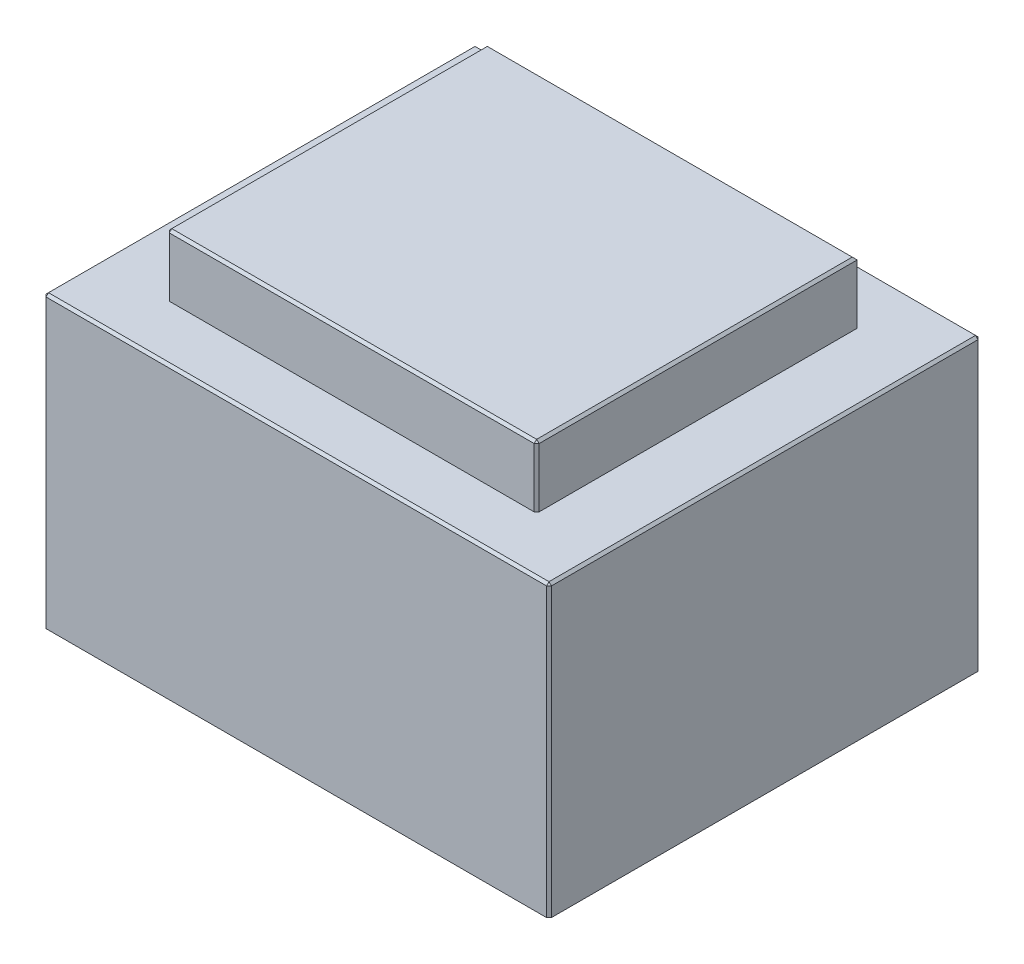
ISO-10303-21;
HEADER;
FILE_DESCRIPTION(('STEP AP214'),'2;1');
FILE_NAME('part.step','',(''),(''),'','','');
FILE_SCHEMA(('AUTOMOTIVE_DESIGN { 1 0 10303 214 1 1 1 1 }'));
ENDSEC;
DATA;
#1=APPLICATION_CONTEXT('core data for automotive mechanical design processes');
#2=APPLICATION_PROTOCOL_DEFINITION('international standard','automotive_design',2000,#1);
#3=PRODUCT_CONTEXT('',#1,'mechanical');
#4=PRODUCT('Part','Part','',(#3));
#5=PRODUCT_RELATED_PRODUCT_CATEGORY('part','',(#4));
#6=PRODUCT_DEFINITION_FORMATION('','',#4);
#7=PRODUCT_DEFINITION_CONTEXT('part definition',#1,'design');
#8=PRODUCT_DEFINITION('design','',#6,#7);
#9=PRODUCT_DEFINITION_SHAPE('','',#8);
#10=(LENGTH_UNIT() NAMED_UNIT(*) SI_UNIT(.MILLI.,.METRE.));
#11=(NAMED_UNIT(*) PLANE_ANGLE_UNIT() SI_UNIT($,.RADIAN.));
#12=(NAMED_UNIT(*) SI_UNIT($,.STERADIAN.) SOLID_ANGLE_UNIT());
#13=UNCERTAINTY_MEASURE_WITH_UNIT(LENGTH_MEASURE(1.E-05),#10,'distance_accuracy_value','');
#14=(GEOMETRIC_REPRESENTATION_CONTEXT(3) GLOBAL_UNCERTAINTY_ASSIGNED_CONTEXT((#13)) GLOBAL_UNIT_ASSIGNED_CONTEXT((#10,
#11,#12)) REPRESENTATION_CONTEXT('',''));
#15=CARTESIAN_POINT('',(0.,0.,0.));
#16=DIRECTION('',(0.,0.,1.));
#17=DIRECTION('',(1.,0.,0.));
#18=AXIS2_PLACEMENT_3D('',#15,#16,#17);
#19=CARTESIAN_POINT('',(0.,0.,0.));
#20=DIRECTION('',(0.,1.,0.));
#21=DIRECTION('',(0.,0.,1.));
#22=AXIS2_PLACEMENT_3D('',#19,#20,#21);
#23=PLANE('',#22);
#24=CARTESIAN_POINT('',(-5.,0.,-12.5));
#25=DIRECTION('',(0.,1.,0.));
#26=DIRECTION('',(0.,0.,1.));
#27=AXIS2_PLACEMENT_3D('',#24,#25,#26);
#28=CIRCLE('',#27,0.4);
#29=CARTESIAN_POINT('',(-5.,0.,-12.1));
#30=VERTEX_POINT('',#29);
#31=EDGE_CURVE('E215',#30,#30,#28,.F.);
#32=ORIENTED_EDGE('',*,*,#31,.F.);
#33=EDGE_LOOP('',(#32));
#34=FACE_BOUND('',#33,.T.);
#35=CARTESIAN_POINT('',(-10.,0.,12.5));
#36=DIRECTION('',(0.,1.,0.));
#37=DIRECTION('',(0.,0.,1.));
#38=AXIS2_PLACEMENT_3D('',#35,#36,#37);
#39=CIRCLE('',#38,0.399999999999999);
#40=CARTESIAN_POINT('',(-10.,0.,12.9));
#41=VERTEX_POINT('',#40);
#42=EDGE_CURVE('E209',#41,#41,#39,.F.);
#43=ORIENTED_EDGE('',*,*,#42,.F.);
#44=EDGE_LOOP('',(#43));
#45=FACE_BOUND('',#44,.T.);
#46=DIRECTION('',(0.,0.,1.));
#47=VECTOR('',#46,1.);
#48=CARTESIAN_POINT('',(-20.5,0.,17.5));
#49=LINE('',#48,#47);
#50=CARTESIAN_POINT('',(-20.5,0.,-17.3));
#51=VERTEX_POINT('',#50);
#52=CARTESIAN_POINT('',(-20.5,0.,17.3));
#53=VERTEX_POINT('',#52);
#54=EDGE_CURVE('E184',#51,#53,#49,.T.);
#55=ORIENTED_EDGE('',*,*,#54,.F.);
#56=DIRECTION('',(-0.707106781186548,0.,0.707106781186548));
#57=VECTOR('',#56,1.);
#58=CARTESIAN_POINT('',(-20.5,0.,-17.3));
#59=LINE('',#58,#57);
#60=CARTESIAN_POINT('',(-20.3,0.,-17.5));
#61=VERTEX_POINT('',#60);
#62=EDGE_CURVE('E262',#51,#61,#59,.F.);
#63=ORIENTED_EDGE('',*,*,#62,.T.);
#64=DIRECTION('',(-1.,0.,0.));
#65=VECTOR('',#64,1.);
#66=CARTESIAN_POINT('',(20.5,0.,-17.5));
#67=LINE('',#66,#65);
#68=CARTESIAN_POINT('',(20.3,0.,-17.5));
#69=VERTEX_POINT('',#68);
#70=EDGE_CURVE('E206',#69,#61,#67,.T.);
#71=ORIENTED_EDGE('',*,*,#70,.F.);
#72=DIRECTION('',(-0.707106781186548,0.,-0.707106781186548));
#73=VECTOR('',#72,1.);
#74=CARTESIAN_POINT('',(20.3,0.,-17.5));
#75=LINE('',#74,#73);
#76=CARTESIAN_POINT('',(20.5,0.,-17.3));
#77=VERTEX_POINT('',#76);
#78=EDGE_CURVE('E260',#69,#77,#75,.F.);
#79=ORIENTED_EDGE('',*,*,#78,.T.);
#80=DIRECTION('',(0.,0.,-1.));
#81=VECTOR('',#80,1.);
#82=CARTESIAN_POINT('',(20.5,0.,17.5));
#83=LINE('',#82,#81);
#84=CARTESIAN_POINT('',(20.5,0.,17.3));
#85=VERTEX_POINT('',#84);
#86=EDGE_CURVE('E203',#85,#77,#83,.T.);
#87=ORIENTED_EDGE('',*,*,#86,.F.);
#88=DIRECTION('',(0.707106781186548,0.,-0.707106781186548));
#89=VECTOR('',#88,1.);
#90=CARTESIAN_POINT('',(20.5,0.,17.3));
#91=LINE('',#90,#89);
#92=CARTESIAN_POINT('',(20.3,0.,17.5));
#93=VERTEX_POINT('',#92);
#94=EDGE_CURVE('E258',#85,#93,#91,.F.);
#95=ORIENTED_EDGE('',*,*,#94,.T.);
#96=DIRECTION('',(1.,0.,0.));
#97=VECTOR('',#96,1.);
#98=CARTESIAN_POINT('',(20.5,0.,17.5));
#99=LINE('',#98,#97);
#100=CARTESIAN_POINT('',(-20.3,0.,17.5));
#101=VERTEX_POINT('',#100);
#102=EDGE_CURVE('E200',#101,#93,#99,.T.);
#103=ORIENTED_EDGE('',*,*,#102,.F.);
#104=DIRECTION('',(0.707106781186548,0.,0.707106781186548));
#105=VECTOR('',#104,1.);
#106=CARTESIAN_POINT('',(-20.3,0.,17.5));
#107=LINE('',#106,#105);
#108=EDGE_CURVE('E256',#101,#53,#107,.F.);
#109=ORIENTED_EDGE('',*,*,#108,.T.);
#110=EDGE_LOOP('',(#55,#63,#71,#79,#87,#95,#103,#109));
#111=FACE_BOUND('',#110,.T.);
#112=CARTESIAN_POINT('',(10.,0.,12.5));
#113=DIRECTION('',(0.,1.,0.));
#114=DIRECTION('',(0.,0.,1.));
#115=AXIS2_PLACEMENT_3D('',#112,#113,#114);
#116=CIRCLE('',#115,0.399999999999999);
#117=CARTESIAN_POINT('',(10.,0.,12.9));
#118=VERTEX_POINT('',#117);
#119=EDGE_CURVE('E212',#118,#118,#116,.F.);
#120=ORIENTED_EDGE('',*,*,#119,.F.);
#121=EDGE_LOOP('',(#120));
#122=FACE_BOUND('',#121,.T.);
#123=CARTESIAN_POINT('',(5.,0.,-12.5));
#124=DIRECTION('',(0.,1.,0.));
#125=DIRECTION('',(0.,0.,1.));
#126=AXIS2_PLACEMENT_3D('',#123,#124,#125);
#127=CIRCLE('',#126,0.4);
#128=CARTESIAN_POINT('',(5.,0.,-12.1));
#129=VERTEX_POINT('',#128);
#130=EDGE_CURVE('E218',#129,#129,#127,.F.);
#131=ORIENTED_EDGE('',*,*,#130,.F.);
#132=EDGE_LOOP('',(#131));
#133=FACE_BOUND('',#132,.T.);
#134=ADVANCED_FACE('F33',(#34,#45,#111,#122,#133),#23,.F.);
#135=CARTESIAN_POINT('',(0.,23.5,0.));
#136=DIRECTION('',(0.,1.,0.));
#137=DIRECTION('',(0.,0.,1.));
#138=AXIS2_PLACEMENT_3D('',#135,#136,#137);
#139=PLANE('',#138);
#140=DIRECTION('',(-1.,0.,0.));
#141=VECTOR('',#140,1.);
#142=CARTESIAN_POINT('',(-20.5,23.5,-17.3));
#143=LINE('',#142,#141);
#144=CARTESIAN_POINT('',(20.3,23.5,-17.3));
#145=VERTEX_POINT('',#144);
#146=CARTESIAN_POINT('',(-20.3,23.5,-17.3));
#147=VERTEX_POINT('',#146);
#148=EDGE_CURVE('E50',#145,#147,#143,.T.);
#149=ORIENTED_EDGE('',*,*,#148,.T.);
#150=DIRECTION('',(0.,0.,1.));
#151=VECTOR('',#150,1.);
#152=CARTESIAN_POINT('',(-20.3,23.5,17.5));
#153=LINE('',#152,#151);
#154=CARTESIAN_POINT('',(-20.3,23.5,17.3));
#155=VERTEX_POINT('',#154);
#156=EDGE_CURVE('E286',#147,#155,#153,.T.);
#157=ORIENTED_EDGE('',*,*,#156,.T.);
#158=DIRECTION('',(1.,0.,0.));
#159=VECTOR('',#158,1.);
#160=CARTESIAN_POINT('',(20.5,23.5,17.3));
#161=LINE('',#160,#159);
#162=CARTESIAN_POINT('',(20.3,23.5,17.3));
#163=VERTEX_POINT('',#162);
#164=EDGE_CURVE('E282',#155,#163,#161,.T.);
#165=ORIENTED_EDGE('',*,*,#164,.T.);
#166=DIRECTION('',(0.,0.,-1.));
#167=VECTOR('',#166,1.);
#168=CARTESIAN_POINT('',(20.3,23.5,-17.5));
#169=LINE('',#168,#167);
#170=EDGE_CURVE('E55',#163,#145,#169,.T.);
#171=ORIENTED_EDGE('',*,*,#170,.T.);
#172=EDGE_LOOP('',(#149,#157,#165,#171));
#173=FACE_BOUND('',#172,.T.);
#174=DIRECTION('',(-1.,0.,0.));
#175=VECTOR('',#174,1.);
#176=CARTESIAN_POINT('',(-15.,23.5,-13.));
#177=LINE('',#176,#175);
#178=CARTESIAN_POINT('',(15.,23.5,-13.));
#179=VERTEX_POINT('',#178);
#180=CARTESIAN_POINT('',(-14.8,23.5,-13.));
#181=VERTEX_POINT('',#180);
#182=EDGE_CURVE('E175',#179,#181,#177,.T.);
#183=ORIENTED_EDGE('',*,*,#182,.F.);
#184=DIRECTION('',(0.,0.,-1.));
#185=VECTOR('',#184,1.);
#186=CARTESIAN_POINT('',(15.,23.5,-13.));
#187=LINE('',#186,#185);
#188=CARTESIAN_POINT('',(15.,23.5,12.8));
#189=VERTEX_POINT('',#188);
#190=EDGE_CURVE('E165',#189,#179,#187,.T.);
#191=ORIENTED_EDGE('',*,*,#190,.F.);
#192=DIRECTION('',(0.707106781186548,0.,-0.707106781186548));
#193=VECTOR('',#192,1.);
#194=CARTESIAN_POINT('',(15.,23.5,12.8));
#195=LINE('',#194,#193);
#196=CARTESIAN_POINT('',(14.8,23.5,13.));
#197=VERTEX_POINT('',#196);
#198=EDGE_CURVE('E11',#189,#197,#195,.F.);
#199=ORIENTED_EDGE('',*,*,#198,.T.);
#200=DIRECTION('',(1.,0.,0.));
#201=VECTOR('',#200,1.);
#202=CARTESIAN_POINT('',(-15.,23.5,13.));
#203=LINE('',#202,#201);
#204=CARTESIAN_POINT('',(-14.8,23.5,13.));
#205=VERTEX_POINT('',#204);
#206=EDGE_CURVE('E185',#205,#197,#203,.T.);
#207=ORIENTED_EDGE('',*,*,#206,.F.);
#208=DIRECTION('',(0.707106781186548,0.,0.707106781186548));
#209=VECTOR('',#208,1.);
#210=CARTESIAN_POINT('',(-14.8,23.5,13.));
#211=LINE('',#210,#209);
#212=CARTESIAN_POINT('',(-15.,23.5,12.8));
#213=VERTEX_POINT('',#212);
#214=EDGE_CURVE('E42',#205,#213,#211,.F.);
#215=ORIENTED_EDGE('',*,*,#214,.T.);
#216=DIRECTION('',(0.,0.,1.));
#217=VECTOR('',#216,1.);
#218=CARTESIAN_POINT('',(-15.,23.5,-13.));
#219=LINE('',#218,#217);
#220=CARTESIAN_POINT('',(-15.,23.5,-12.8));
#221=VERTEX_POINT('',#220);
#222=EDGE_CURVE('E190',#221,#213,#219,.T.);
#223=ORIENTED_EDGE('',*,*,#222,.F.);
#224=DIRECTION('',(-0.707106781186548,0.,0.707106781186548));
#225=VECTOR('',#224,1.);
#226=CARTESIAN_POINT('',(-15.,23.5,-12.8));
#227=LINE('',#226,#225);
#228=EDGE_CURVE('E189',#221,#181,#227,.F.);
#229=ORIENTED_EDGE('',*,*,#228,.T.);
#230=EDGE_LOOP('',(#183,#191,#199,#207,#215,#223,#229));
#231=FACE_BOUND('',#230,.T.);
#232=ADVANCED_FACE('F187',(#173,#231),#139,.T.);
#233=CARTESIAN_POINT('',(-20.5,23.5,17.5));
#234=DIRECTION('',(1.,0.,0.));
#235=DIRECTION('',(0.,0.,-1.));
#236=AXIS2_PLACEMENT_3D('',#233,#234,#235);
#237=PLANE('',#236);
#238=DIRECTION('',(0.,0.,-1.));
#239=VECTOR('',#238,1.);
#240=CARTESIAN_POINT('',(-20.5,23.3,-17.5));
#241=LINE('',#240,#239);
#242=CARTESIAN_POINT('',(-20.5,23.3,17.3));
#243=VERTEX_POINT('',#242);
#244=CARTESIAN_POINT('',(-20.5,23.3,-17.3));
#245=VERTEX_POINT('',#244);
#246=EDGE_CURVE('E249',#243,#245,#241,.T.);
#247=ORIENTED_EDGE('',*,*,#246,.T.);
#248=DIRECTION('',(0.,-1.,0.));
#249=VECTOR('',#248,1.);
#250=CARTESIAN_POINT('',(-20.5,23.5,-17.3));
#251=LINE('',#250,#249);
#252=EDGE_CURVE('E253',#245,#51,#251,.T.);
#253=ORIENTED_EDGE('',*,*,#252,.T.);
#254=ORIENTED_EDGE('',*,*,#54,.T.);
#255=DIRECTION('',(0.,1.,0.));
#256=VECTOR('',#255,1.);
#257=CARTESIAN_POINT('',(-20.5,23.5,17.3));
#258=LINE('',#257,#256);
#259=EDGE_CURVE('E251',#53,#243,#258,.T.);
#260=ORIENTED_EDGE('',*,*,#259,.T.);
#261=EDGE_LOOP('',(#247,#253,#254,#260));
#262=FACE_BOUND('',#261,.T.);
#263=ADVANCED_FACE('F408',(#262),#237,.F.);
#264=CARTESIAN_POINT('',(20.5,23.5,17.5));
#265=DIRECTION('',(0.,0.,-1.));
#266=DIRECTION('',(-1.,0.,0.));
#267=AXIS2_PLACEMENT_3D('',#264,#265,#266);
#268=PLANE('',#267);
#269=ORIENTED_EDGE('',*,*,#102,.T.);
#270=DIRECTION('',(0.,1.,0.));
#271=VECTOR('',#270,1.);
#272=CARTESIAN_POINT('',(20.3,23.5,17.5));
#273=LINE('',#272,#271);
#274=CARTESIAN_POINT('',(20.3,23.3,17.5));
#275=VERTEX_POINT('',#274);
#276=EDGE_CURVE('E280',#93,#275,#273,.T.);
#277=ORIENTED_EDGE('',*,*,#276,.T.);
#278=DIRECTION('',(-1.,0.,0.));
#279=VECTOR('',#278,1.);
#280=CARTESIAN_POINT('',(-20.5,23.3,17.5));
#281=LINE('',#280,#279);
#282=CARTESIAN_POINT('',(-20.3,23.3,17.5));
#283=VERTEX_POINT('',#282);
#284=EDGE_CURVE('E276',#275,#283,#281,.T.);
#285=ORIENTED_EDGE('',*,*,#284,.T.);
#286=DIRECTION('',(0.,-1.,0.));
#287=VECTOR('',#286,1.);
#288=CARTESIAN_POINT('',(-20.3,23.5,17.5));
#289=LINE('',#288,#287);
#290=EDGE_CURVE('E278',#283,#101,#289,.T.);
#291=ORIENTED_EDGE('',*,*,#290,.T.);
#292=EDGE_LOOP('',(#269,#277,#285,#291));
#293=FACE_BOUND('',#292,.T.);
#294=ADVANCED_FACE('F401',(#293),#268,.F.);
#295=CARTESIAN_POINT('',(20.5,23.5,17.5));
#296=DIRECTION('',(-1.,0.,0.));
#297=DIRECTION('',(0.,0.,1.));
#298=AXIS2_PLACEMENT_3D('',#295,#296,#297);
#299=PLANE('',#298);
#300=ORIENTED_EDGE('',*,*,#86,.T.);
#301=DIRECTION('',(0.,1.,0.));
#302=VECTOR('',#301,1.);
#303=CARTESIAN_POINT('',(20.5,23.5,-17.3));
#304=LINE('',#303,#302);
#305=CARTESIAN_POINT('',(20.5,23.3,-17.3));
#306=VERTEX_POINT('',#305);
#307=EDGE_CURVE('E274',#77,#306,#304,.T.);
#308=ORIENTED_EDGE('',*,*,#307,.T.);
#309=DIRECTION('',(0.,0.,1.));
#310=VECTOR('',#309,1.);
#311=CARTESIAN_POINT('',(20.5,23.3,17.5));
#312=LINE('',#311,#310);
#313=CARTESIAN_POINT('',(20.5,23.3,17.3));
#314=VERTEX_POINT('',#313);
#315=EDGE_CURVE('E270',#306,#314,#312,.T.);
#316=ORIENTED_EDGE('',*,*,#315,.T.);
#317=DIRECTION('',(0.,-1.,0.));
#318=VECTOR('',#317,1.);
#319=CARTESIAN_POINT('',(20.5,23.5,17.3));
#320=LINE('',#319,#318);
#321=EDGE_CURVE('E272',#314,#85,#320,.T.);
#322=ORIENTED_EDGE('',*,*,#321,.T.);
#323=EDGE_LOOP('',(#300,#308,#316,#322));
#324=FACE_BOUND('',#323,.T.);
#325=ADVANCED_FACE('F366',(#324),#299,.F.);
#326=CARTESIAN_POINT('',(20.5,23.5,-17.5));
#327=DIRECTION('',(0.,0.,1.));
#328=DIRECTION('',(1.,0.,0.));
#329=AXIS2_PLACEMENT_3D('',#326,#327,#328);
#330=PLANE('',#329);
#331=ORIENTED_EDGE('',*,*,#70,.T.);
#332=DIRECTION('',(0.,1.,0.));
#333=VECTOR('',#332,1.);
#334=CARTESIAN_POINT('',(-20.3,23.5,-17.5));
#335=LINE('',#334,#333);
#336=CARTESIAN_POINT('',(-20.3,23.3,-17.5));
#337=VERTEX_POINT('',#336);
#338=EDGE_CURVE('E268',#61,#337,#335,.T.);
#339=ORIENTED_EDGE('',*,*,#338,.T.);
#340=DIRECTION('',(1.,0.,0.));
#341=VECTOR('',#340,1.);
#342=CARTESIAN_POINT('',(20.5,23.3,-17.5));
#343=LINE('',#342,#341);
#344=CARTESIAN_POINT('',(20.3,23.3,-17.5));
#345=VERTEX_POINT('',#344);
#346=EDGE_CURVE('E264',#337,#345,#343,.T.);
#347=ORIENTED_EDGE('',*,*,#346,.T.);
#348=DIRECTION('',(0.,-1.,0.));
#349=VECTOR('',#348,1.);
#350=CARTESIAN_POINT('',(20.3,23.5,-17.5));
#351=LINE('',#350,#349);
#352=EDGE_CURVE('E266',#345,#69,#351,.T.);
#353=ORIENTED_EDGE('',*,*,#352,.T.);
#354=EDGE_LOOP('',(#331,#339,#347,#353));
#355=FACE_BOUND('',#354,.T.);
#356=ADVANCED_FACE('F413',(#355),#330,.F.);
#357=CARTESIAN_POINT('',(15.,28.5,-13.));
#358=DIRECTION('',(-1.,0.,0.));
#359=DIRECTION('',(0.,0.,1.));
#360=AXIS2_PLACEMENT_3D('',#357,#358,#359);
#361=PLANE('',#360);
#362=DIRECTION('',(0.,-1.,0.));
#363=VECTOR('',#362,1.);
#364=CARTESIAN_POINT('',(15.,28.5,-13.));
#365=LINE('',#364,#363);
#366=CARTESIAN_POINT('',(15.,28.3,-13.));
#367=VERTEX_POINT('',#366);
#368=EDGE_CURVE('E168',#367,#179,#365,.T.);
#369=ORIENTED_EDGE('',*,*,#368,.F.);
#370=DIRECTION('',(0.,0.,1.));
#371=VECTOR('',#370,1.);
#372=CARTESIAN_POINT('',(15.,28.3,13.));
#373=LINE('',#372,#371);
#374=CARTESIAN_POINT('',(15.,28.3,12.8));
#375=VERTEX_POINT('',#374);
#376=EDGE_CURVE('E247',#367,#375,#373,.T.);
#377=ORIENTED_EDGE('',*,*,#376,.T.);
#378=DIRECTION('',(0.,-1.,0.));
#379=VECTOR('',#378,1.);
#380=CARTESIAN_POINT('',(15.,28.5,12.8));
#381=LINE('',#380,#379);
#382=EDGE_CURVE('E171',#375,#189,#381,.T.);
#383=ORIENTED_EDGE('',*,*,#382,.T.);
#384=ORIENTED_EDGE('',*,*,#190,.T.);
#385=EDGE_LOOP('',(#369,#377,#383,#384));
#386=FACE_BOUND('',#385,.T.);
#387=ADVANCED_FACE('F167',(#386),#361,.F.);
#388=CARTESIAN_POINT('',(-15.,28.5,-13.));
#389=DIRECTION('',(0.,0.,1.));
#390=DIRECTION('',(1.,0.,0.));
#391=AXIS2_PLACEMENT_3D('',#388,#389,#390);
#392=PLANE('',#391);
#393=ORIENTED_EDGE('',*,*,#182,.T.);
#394=DIRECTION('',(0.,1.,0.));
#395=VECTOR('',#394,1.);
#396=CARTESIAN_POINT('',(-14.8,28.5,-13.));
#397=LINE('',#396,#395);
#398=CARTESIAN_POINT('',(-14.8,28.3,-13.));
#399=VERTEX_POINT('',#398);
#400=EDGE_CURVE('E229',#181,#399,#397,.T.);
#401=ORIENTED_EDGE('',*,*,#400,.T.);
#402=DIRECTION('',(1.,0.,0.));
#403=VECTOR('',#402,1.);
#404=CARTESIAN_POINT('',(15.,28.3,-13.));
#405=LINE('',#404,#403);
#406=EDGE_CURVE('E183',#399,#367,#405,.T.);
#407=ORIENTED_EDGE('',*,*,#406,.T.);
#408=ORIENTED_EDGE('',*,*,#368,.T.);
#409=EDGE_LOOP('',(#393,#401,#407,#408));
#410=FACE_BOUND('',#409,.T.);
#411=ADVANCED_FACE('F180',(#410),#392,.F.);
#412=CARTESIAN_POINT('',(-15.,28.5,-13.));
#413=DIRECTION('',(1.,0.,0.));
#414=DIRECTION('',(0.,0.,-1.));
#415=AXIS2_PLACEMENT_3D('',#412,#413,#414);
#416=PLANE('',#415);
#417=DIRECTION('',(0.,0.,-1.));
#418=VECTOR('',#417,1.);
#419=CARTESIAN_POINT('',(-15.,28.3,-13.));
#420=LINE('',#419,#418);
#421=CARTESIAN_POINT('',(-15.,28.3,12.8));
#422=VERTEX_POINT('',#421);
#423=CARTESIAN_POINT('',(-15.,28.3,-12.8));
#424=VERTEX_POINT('',#423);
#425=EDGE_CURVE('E221',#422,#424,#420,.T.);
#426=ORIENTED_EDGE('',*,*,#425,.T.);
#427=DIRECTION('',(0.,-1.,0.));
#428=VECTOR('',#427,1.);
#429=CARTESIAN_POINT('',(-15.,28.5,-12.8));
#430=LINE('',#429,#428);
#431=EDGE_CURVE('E225',#424,#221,#430,.T.);
#432=ORIENTED_EDGE('',*,*,#431,.T.);
#433=ORIENTED_EDGE('',*,*,#222,.T.);
#434=DIRECTION('',(0.,1.,0.));
#435=VECTOR('',#434,1.);
#436=CARTESIAN_POINT('',(-15.,28.5,12.8));
#437=LINE('',#436,#435);
#438=EDGE_CURVE('E223',#213,#422,#437,.T.);
#439=ORIENTED_EDGE('',*,*,#438,.T.);
#440=EDGE_LOOP('',(#426,#432,#433,#439));
#441=FACE_BOUND('',#440,.T.);
#442=ADVANCED_FACE('F435',(#441),#416,.F.);
#443=CARTESIAN_POINT('',(-15.,28.5,13.));
#444=DIRECTION('',(0.,0.,-1.));
#445=DIRECTION('',(-1.,0.,0.));
#446=AXIS2_PLACEMENT_3D('',#443,#444,#445);
#447=PLANE('',#446);
#448=DIRECTION('',(-1.,0.,0.));
#449=VECTOR('',#448,1.);
#450=CARTESIAN_POINT('',(-15.,28.3,13.));
#451=LINE('',#450,#449);
#452=CARTESIAN_POINT('',(14.8,28.3,13.));
#453=VERTEX_POINT('',#452);
#454=CARTESIAN_POINT('',(-14.8,28.3,13.));
#455=VERTEX_POINT('',#454);
#456=EDGE_CURVE('E233',#453,#455,#451,.T.);
#457=ORIENTED_EDGE('',*,*,#456,.T.);
#458=DIRECTION('',(0.,-1.,0.));
#459=VECTOR('',#458,1.);
#460=CARTESIAN_POINT('',(-14.8,28.5,13.));
#461=LINE('',#460,#459);
#462=EDGE_CURVE('E235',#455,#205,#461,.T.);
#463=ORIENTED_EDGE('',*,*,#462,.T.);
#464=ORIENTED_EDGE('',*,*,#206,.T.);
#465=DIRECTION('',(0.,1.,0.));
#466=VECTOR('',#465,1.);
#467=CARTESIAN_POINT('',(14.8,28.5,13.));
#468=LINE('',#467,#466);
#469=EDGE_CURVE('E231',#197,#453,#468,.T.);
#470=ORIENTED_EDGE('',*,*,#469,.T.);
#471=EDGE_LOOP('',(#457,#463,#464,#470));
#472=FACE_BOUND('',#471,.T.);
#473=ADVANCED_FACE('F438',(#472),#447,.F.);
#474=CARTESIAN_POINT('',(0.,28.5,0.));
#475=DIRECTION('',(0.,1.,0.));
#476=DIRECTION('',(0.,0.,1.));
#477=AXIS2_PLACEMENT_3D('',#474,#475,#476);
#478=PLANE('',#477);
#479=DIRECTION('',(0.,0.,1.));
#480=VECTOR('',#479,1.);
#481=CARTESIAN_POINT('',(-14.8,28.5,13.));
#482=LINE('',#481,#480);
#483=CARTESIAN_POINT('',(-14.8,28.5,-12.8));
#484=VERTEX_POINT('',#483);
#485=CARTESIAN_POINT('',(-14.8,28.5,12.8));
#486=VERTEX_POINT('',#485);
#487=EDGE_CURVE('E241',#484,#486,#482,.T.);
#488=ORIENTED_EDGE('',*,*,#487,.T.);
#489=DIRECTION('',(1.,0.,0.));
#490=VECTOR('',#489,1.);
#491=CARTESIAN_POINT('',(15.,28.5,12.8));
#492=LINE('',#491,#490);
#493=CARTESIAN_POINT('',(14.8,28.5,12.8));
#494=VERTEX_POINT('',#493);
#495=EDGE_CURVE('E243',#486,#494,#492,.T.);
#496=ORIENTED_EDGE('',*,*,#495,.T.);
#497=DIRECTION('',(0.,0.,-1.));
#498=VECTOR('',#497,1.);
#499=CARTESIAN_POINT('',(14.8,28.5,-13.));
#500=LINE('',#499,#498);
#501=CARTESIAN_POINT('',(14.8,28.5,-12.8));
#502=VERTEX_POINT('',#501);
#503=EDGE_CURVE('E237',#494,#502,#500,.T.);
#504=ORIENTED_EDGE('',*,*,#503,.T.);
#505=DIRECTION('',(-1.,0.,0.));
#506=VECTOR('',#505,1.);
#507=CARTESIAN_POINT('',(-15.,28.5,-12.8));
#508=LINE('',#507,#506);
#509=EDGE_CURVE('E239',#502,#484,#508,.T.);
#510=ORIENTED_EDGE('',*,*,#509,.T.);
#511=EDGE_LOOP('',(#488,#496,#504,#510));
#512=FACE_BOUND('',#511,.T.);
#513=ADVANCED_FACE('F442',(#512),#478,.T.);
#514=CARTESIAN_POINT('',(-10.,-2.5,12.5));
#515=DIRECTION('',(0.,1.,0.));
#516=DIRECTION('',(0.,0.,1.));
#517=AXIS2_PLACEMENT_3D('',#514,#515,#516);
#518=CYLINDRICAL_SURFACE('',#517,0.399999999999999);
#519=CARTESIAN_POINT('',(-10.,-2.5,12.5));
#520=DIRECTION('',(0.,-1.,0.));
#521=DIRECTION('',(0.,0.,-1.));
#522=AXIS2_PLACEMENT_3D('',#519,#520,#521);
#523=CIRCLE('',#522,0.399999999999999);
#524=CARTESIAN_POINT('',(-10.,-2.5,12.1));
#525=VERTEX_POINT('',#524);
#526=EDGE_CURVE('E176',#525,#525,#523,.T.);
#527=ORIENTED_EDGE('',*,*,#526,.F.);
#528=EDGE_LOOP('',(#527));
#529=FACE_BOUND('',#528,.T.);
#530=ORIENTED_EDGE('',*,*,#42,.T.);
#531=EDGE_LOOP('',(#530));
#532=FACE_BOUND('',#531,.T.);
#533=ADVANCED_FACE('F446',(#529,#532),#518,.T.);
#534=CARTESIAN_POINT('',(-10.,-2.5,12.5));
#535=DIRECTION('',(0.,-1.,0.));
#536=DIRECTION('',(0.,0.,-1.));
#537=AXIS2_PLACEMENT_3D('',#534,#535,#536);
#538=PLANE('',#537);
#539=ORIENTED_EDGE('',*,*,#526,.T.);
#540=EDGE_LOOP('',(#539));
#541=FACE_BOUND('',#540,.T.);
#542=ADVANCED_FACE('F450',(#541),#538,.T.);
#543=CARTESIAN_POINT('',(10.,-2.5,12.5));
#544=DIRECTION('',(0.,1.,0.));
#545=DIRECTION('',(0.,0.,1.));
#546=AXIS2_PLACEMENT_3D('',#543,#544,#545);
#547=CYLINDRICAL_SURFACE('',#546,0.399999999999999);
#548=CARTESIAN_POINT('',(10.,-2.5,12.5));
#549=DIRECTION('',(0.,-1.,0.));
#550=DIRECTION('',(0.,0.,-1.));
#551=AXIS2_PLACEMENT_3D('',#548,#549,#550);
#552=CIRCLE('',#551,0.399999999999999);
#553=CARTESIAN_POINT('',(10.,-2.5,12.1));
#554=VERTEX_POINT('',#553);
#555=EDGE_CURVE('E489',#554,#554,#552,.T.);
#556=ORIENTED_EDGE('',*,*,#555,.F.);
#557=EDGE_LOOP('',(#556));
#558=FACE_BOUND('',#557,.T.);
#559=ORIENTED_EDGE('',*,*,#119,.T.);
#560=EDGE_LOOP('',(#559));
#561=FACE_BOUND('',#560,.T.);
#562=ADVANCED_FACE('F454',(#558,#561),#547,.T.);
#563=CARTESIAN_POINT('',(10.,-2.5,12.5));
#564=DIRECTION('',(0.,-1.,0.));
#565=DIRECTION('',(0.,0.,-1.));
#566=AXIS2_PLACEMENT_3D('',#563,#564,#565);
#567=PLANE('',#566);
#568=ORIENTED_EDGE('',*,*,#555,.T.);
#569=EDGE_LOOP('',(#568));
#570=FACE_BOUND('',#569,.T.);
#571=ADVANCED_FACE('F458',(#570),#567,.T.);
#572=CARTESIAN_POINT('',(-5.,-2.5,-12.5));
#573=DIRECTION('',(0.,1.,0.));
#574=DIRECTION('',(0.,0.,1.));
#575=AXIS2_PLACEMENT_3D('',#572,#573,#574);
#576=CYLINDRICAL_SURFACE('',#575,0.4);
#577=CARTESIAN_POINT('',(-5.,-2.5,-12.5));
#578=DIRECTION('',(0.,-1.,0.));
#579=DIRECTION('',(0.,0.,-1.));
#580=AXIS2_PLACEMENT_3D('',#577,#578,#579);
#581=CIRCLE('',#580,0.4);
#582=CARTESIAN_POINT('',(-5.,-2.5,-12.9));
#583=VERTEX_POINT('',#582);
#584=EDGE_CURVE('E486',#583,#583,#581,.T.);
#585=ORIENTED_EDGE('',*,*,#584,.F.);
#586=EDGE_LOOP('',(#585));
#587=FACE_BOUND('',#586,.T.);
#588=ORIENTED_EDGE('',*,*,#31,.T.);
#589=EDGE_LOOP('',(#588));
#590=FACE_BOUND('',#589,.T.);
#591=ADVANCED_FACE('F462',(#587,#590),#576,.T.);
#592=CARTESIAN_POINT('',(-5.,-2.5,-12.5));
#593=DIRECTION('',(0.,-1.,0.));
#594=DIRECTION('',(0.,0.,-1.));
#595=AXIS2_PLACEMENT_3D('',#592,#593,#594);
#596=PLANE('',#595);
#597=ORIENTED_EDGE('',*,*,#584,.T.);
#598=EDGE_LOOP('',(#597));
#599=FACE_BOUND('',#598,.T.);
#600=ADVANCED_FACE('F466',(#599),#596,.T.);
#601=CARTESIAN_POINT('',(5.,-2.5,-12.5));
#602=DIRECTION('',(0.,1.,0.));
#603=DIRECTION('',(0.,0.,1.));
#604=AXIS2_PLACEMENT_3D('',#601,#602,#603);
#605=CYLINDRICAL_SURFACE('',#604,0.4);
#606=CARTESIAN_POINT('',(5.,-2.5,-12.5));
#607=DIRECTION('',(0.,-1.,0.));
#608=DIRECTION('',(0.,0.,-1.));
#609=AXIS2_PLACEMENT_3D('',#606,#607,#608);
#610=CIRCLE('',#609,0.4);
#611=CARTESIAN_POINT('',(5.,-2.5,-12.9));
#612=VERTEX_POINT('',#611);
#613=EDGE_CURVE('E320',#612,#612,#610,.T.);
#614=ORIENTED_EDGE('',*,*,#613,.F.);
#615=EDGE_LOOP('',(#614));
#616=FACE_BOUND('',#615,.T.);
#617=ORIENTED_EDGE('',*,*,#130,.T.);
#618=EDGE_LOOP('',(#617));
#619=FACE_BOUND('',#618,.T.);
#620=ADVANCED_FACE('F470',(#616,#619),#605,.T.);
#621=CARTESIAN_POINT('',(5.,-2.5,-12.5));
#622=DIRECTION('',(0.,-1.,0.));
#623=DIRECTION('',(0.,0.,-1.));
#624=AXIS2_PLACEMENT_3D('',#621,#622,#623);
#625=PLANE('',#624);
#626=ORIENTED_EDGE('',*,*,#613,.T.);
#627=EDGE_LOOP('',(#626));
#628=FACE_BOUND('',#627,.T.);
#629=ADVANCED_FACE('F474',(#628),#625,.T.);
#630=CARTESIAN_POINT('',(15.,28.5,12.8));
#631=DIRECTION('',(-0.707106781186548,0.,-0.707106781186548));
#632=DIRECTION('',(0.,-1.,0.));
#633=AXIS2_PLACEMENT_3D('',#630,#631,#632);
#634=PLANE('',#633);
#635=DIRECTION('',(-0.707106781186548,0.,0.707106781186548));
#636=VECTOR('',#635,1.);
#637=CARTESIAN_POINT('',(14.9,28.3,12.9));
#638=LINE('',#637,#636);
#639=EDGE_CURVE('E317',#453,#375,#638,.F.);
#640=ORIENTED_EDGE('',*,*,#639,.F.);
#641=ORIENTED_EDGE('',*,*,#469,.F.);
#642=ORIENTED_EDGE('',*,*,#198,.F.);
#643=ORIENTED_EDGE('',*,*,#382,.F.);
#644=EDGE_LOOP('',(#640,#641,#642,#643));
#645=FACE_BOUND('',#644,.T.);
#646=ADVANCED_FACE('F477',(#645),#634,.F.);
#647=CARTESIAN_POINT('',(14.8,28.5,12.8));
#648=DIRECTION('',(0.577350269189624,0.577350269189629,0.577350269189624));
#649=DIRECTION('',(0.,-0.707106781186544,0.707106781186551));
#650=AXIS2_PLACEMENT_3D('',#647,#648,#649);
#651=PLANE('',#650);
#652=DIRECTION('',(-0.707106781186549,0.707106781186546,0.));
#653=VECTOR('',#652,1.);
#654=CARTESIAN_POINT('',(14.8,28.5,12.8));
#655=LINE('',#654,#653);
#656=EDGE_CURVE('E311',#494,#375,#655,.F.);
#657=ORIENTED_EDGE('',*,*,#656,.F.);
#658=DIRECTION('',(0.,-0.707106781186548,0.707106781186548));
#659=VECTOR('',#658,1.);
#660=CARTESIAN_POINT('',(14.8,28.5,12.8));
#661=LINE('',#660,#659);
#662=EDGE_CURVE('E314',#453,#494,#661,.F.);
#663=ORIENTED_EDGE('',*,*,#662,.F.);
#664=ORIENTED_EDGE('',*,*,#639,.T.);
#665=EDGE_LOOP('',(#657,#663,#664));
#666=FACE_BOUND('',#665,.T.);
#667=ADVANCED_FACE('F481',(#666),#651,.T.);
#668=CARTESIAN_POINT('',(0.,28.5,12.8));
#669=DIRECTION('',(0.,0.707106781186548,0.707106781186548));
#670=DIRECTION('',(-1.,0.,0.));
#671=AXIS2_PLACEMENT_3D('',#668,#669,#670);
#672=PLANE('',#671);
#673=ORIENTED_EDGE('',*,*,#662,.T.);
#674=ORIENTED_EDGE('',*,*,#495,.F.);
#675=DIRECTION('',(0.,0.707106781186548,-0.707106781186548));
#676=VECTOR('',#675,1.);
#677=CARTESIAN_POINT('',(-14.8,28.4,12.9));
#678=LINE('',#677,#676);
#679=EDGE_CURVE('E308',#455,#486,#678,.T.);
#680=ORIENTED_EDGE('',*,*,#679,.F.);
#681=ORIENTED_EDGE('',*,*,#456,.F.);
#682=EDGE_LOOP('',(#673,#674,#680,#681));
#683=FACE_BOUND('',#682,.T.);
#684=ADVANCED_FACE('F508',(#683),#672,.T.);
#685=CARTESIAN_POINT('',(-14.8,28.5,13.));
#686=DIRECTION('',(0.707106781186548,0.,-0.707106781186548));
#687=DIRECTION('',(0.,-1.,0.));
#688=AXIS2_PLACEMENT_3D('',#685,#686,#687);
#689=PLANE('',#688);
#690=ORIENTED_EDGE('',*,*,#214,.F.);
#691=ORIENTED_EDGE('',*,*,#462,.F.);
#692=DIRECTION('',(-0.707106781186548,0.,-0.707106781186548));
#693=VECTOR('',#692,1.);
#694=CARTESIAN_POINT('',(-15.,28.3,12.8));
#695=LINE('',#694,#693);
#696=EDGE_CURVE('E305',#422,#455,#695,.F.);
#697=ORIENTED_EDGE('',*,*,#696,.F.);
#698=ORIENTED_EDGE('',*,*,#438,.F.);
#699=EDGE_LOOP('',(#690,#691,#697,#698));
#700=FACE_BOUND('',#699,.T.);
#701=ADVANCED_FACE('F569',(#700),#689,.F.);
#702=CARTESIAN_POINT('',(14.8,28.5,0.));
#703=DIRECTION('',(0.707106781186546,0.707106781186549,0.));
#704=DIRECTION('',(0.,0.,1.));
#705=AXIS2_PLACEMENT_3D('',#702,#703,#704);
#706=PLANE('',#705);
#707=ORIENTED_EDGE('',*,*,#656,.T.);
#708=ORIENTED_EDGE('',*,*,#376,.F.);
#709=DIRECTION('',(-0.577350269189627,0.577350269189625,0.577350269189625));
#710=VECTOR('',#709,1.);
#711=CARTESIAN_POINT('',(10.5333333333333,32.7666666666667,-8.53333333333334));
#712=LINE('',#711,#710);
#713=EDGE_CURVE('E302',#502,#367,#712,.F.);
#714=ORIENTED_EDGE('',*,*,#713,.F.);
#715=ORIENTED_EDGE('',*,*,#503,.F.);
#716=EDGE_LOOP('',(#707,#708,#714,#715));
#717=FACE_BOUND('',#716,.T.);
#718=ADVANCED_FACE('F565',(#717),#706,.T.);
#719=CARTESIAN_POINT('',(-15.,28.3,12.8));
#720=DIRECTION('',(-0.577350269189626,0.577350269189626,0.577350269189626));
#721=DIRECTION('',(0.707106781186547,0.,0.707106781186547));
#722=AXIS2_PLACEMENT_3D('',#719,#720,#721);
#723=PLANE('',#722);
#724=ORIENTED_EDGE('',*,*,#696,.T.);
#725=ORIENTED_EDGE('',*,*,#679,.T.);
#726=DIRECTION('',(-0.707106781186546,-0.707106781186549,0.));
#727=VECTOR('',#726,1.);
#728=CARTESIAN_POINT('',(-15.,28.3,12.8));
#729=LINE('',#728,#727);
#730=EDGE_CURVE('E299',#422,#486,#729,.F.);
#731=ORIENTED_EDGE('',*,*,#730,.F.);
#732=EDGE_LOOP('',(#724,#725,#731));
#733=FACE_BOUND('',#732,.T.);
#734=ADVANCED_FACE('F561',(#733),#723,.T.);
#735=CARTESIAN_POINT('',(0.,28.5,-12.8));
#736=DIRECTION('',(0.,0.707106781186548,-0.707106781186548));
#737=DIRECTION('',(1.,0.,0.));
#738=AXIS2_PLACEMENT_3D('',#735,#736,#737);
#739=PLANE('',#738);
#740=ORIENTED_EDGE('',*,*,#713,.T.);
#741=ORIENTED_EDGE('',*,*,#406,.F.);
#742=DIRECTION('',(0.,-0.707106781186548,-0.707106781186548));
#743=VECTOR('',#742,1.);
#744=CARTESIAN_POINT('',(-14.8,28.3,-13.));
#745=LINE('',#744,#743);
#746=EDGE_CURVE('E296',#484,#399,#745,.T.);
#747=ORIENTED_EDGE('',*,*,#746,.F.);
#748=ORIENTED_EDGE('',*,*,#509,.F.);
#749=EDGE_LOOP('',(#740,#741,#747,#748));
#750=FACE_BOUND('',#749,.T.);
#751=ADVANCED_FACE('F557',(#750),#739,.T.);
#752=CARTESIAN_POINT('',(-14.8,28.5,0.));
#753=DIRECTION('',(-0.707106781186549,0.707106781186546,0.));
#754=DIRECTION('',(0.,0.,-1.));
#755=AXIS2_PLACEMENT_3D('',#752,#753,#754);
#756=PLANE('',#755);
#757=ORIENTED_EDGE('',*,*,#730,.T.);
#758=ORIENTED_EDGE('',*,*,#487,.F.);
#759=DIRECTION('',(0.707106781186546,0.707106781186549,0.));
#760=VECTOR('',#759,1.);
#761=CARTESIAN_POINT('',(-14.9,28.4,-12.8));
#762=LINE('',#761,#760);
#763=EDGE_CURVE('E293',#424,#484,#762,.T.);
#764=ORIENTED_EDGE('',*,*,#763,.F.);
#765=ORIENTED_EDGE('',*,*,#425,.F.);
#766=EDGE_LOOP('',(#757,#758,#764,#765));
#767=FACE_BOUND('',#766,.T.);
#768=ADVANCED_FACE('F549',(#767),#756,.T.);
#769=CARTESIAN_POINT('',(-14.8,28.3,-13.));
#770=DIRECTION('',(-0.577350269189626,0.577350269189626,-0.577350269189626));
#771=DIRECTION('',(-0.707106781186547,0.,0.707106781186547));
#772=AXIS2_PLACEMENT_3D('',#769,#770,#771);
#773=PLANE('',#772);
#774=ORIENTED_EDGE('',*,*,#763,.T.);
#775=ORIENTED_EDGE('',*,*,#746,.T.);
#776=DIRECTION('',(0.707106781186548,0.,-0.707106781186548));
#777=VECTOR('',#776,1.);
#778=CARTESIAN_POINT('',(-14.8,28.3,-13.));
#779=LINE('',#778,#777);
#780=EDGE_CURVE('E290',#424,#399,#779,.T.);
#781=ORIENTED_EDGE('',*,*,#780,.F.);
#782=EDGE_LOOP('',(#774,#775,#781));
#783=FACE_BOUND('',#782,.T.);
#784=ADVANCED_FACE('F543',(#783),#773,.T.);
#785=CARTESIAN_POINT('',(-15.,28.5,-12.8));
#786=DIRECTION('',(0.707106781186548,0.,0.707106781186548));
#787=DIRECTION('',(0.,-1.,0.));
#788=AXIS2_PLACEMENT_3D('',#785,#786,#787);
#789=PLANE('',#788);
#790=ORIENTED_EDGE('',*,*,#780,.T.);
#791=ORIENTED_EDGE('',*,*,#400,.F.);
#792=ORIENTED_EDGE('',*,*,#228,.F.);
#793=ORIENTED_EDGE('',*,*,#431,.F.);
#794=EDGE_LOOP('',(#790,#791,#792,#793));
#795=FACE_BOUND('',#794,.T.);
#796=ADVANCED_FACE('F539',(#795),#789,.F.);
#797=CARTESIAN_POINT('',(20.5,23.5,17.3));
#798=DIRECTION('',(-0.707106781186548,0.,-0.707106781186548));
#799=DIRECTION('',(0.,-1.,0.));
#800=AXIS2_PLACEMENT_3D('',#797,#798,#799);
#801=PLANE('',#800);
#802=DIRECTION('',(-0.707106781186547,0.,0.707106781186547));
#803=VECTOR('',#802,1.);
#804=CARTESIAN_POINT('',(20.3,23.3,17.5));
#805=LINE('',#804,#803);
#806=EDGE_CURVE('E37',#275,#314,#805,.F.);
#807=ORIENTED_EDGE('',*,*,#806,.F.);
#808=ORIENTED_EDGE('',*,*,#276,.F.);
#809=ORIENTED_EDGE('',*,*,#94,.F.);
#810=ORIENTED_EDGE('',*,*,#321,.F.);
#811=EDGE_LOOP('',(#807,#808,#809,#810));
#812=FACE_BOUND('',#811,.T.);
#813=ADVANCED_FACE('F35',(#812),#801,.F.);
#814=CARTESIAN_POINT('',(20.3,23.3,17.5));
#815=DIRECTION('',(0.577350269189626,0.577350269189626,0.577350269189626));
#816=DIRECTION('',(0.707106781186548,0.,-0.707106781186548));
#817=AXIS2_PLACEMENT_3D('',#814,#815,#816);
#818=PLANE('',#817);
#819=DIRECTION('',(0.,-0.707106781186547,0.707106781186547));
#820=VECTOR('',#819,1.);
#821=CARTESIAN_POINT('',(20.3,23.3,17.5));
#822=LINE('',#821,#820);
#823=EDGE_CURVE('E347',#275,#163,#822,.F.);
#824=ORIENTED_EDGE('',*,*,#823,.F.);
#825=ORIENTED_EDGE('',*,*,#806,.T.);
#826=DIRECTION('',(-0.707106781186547,0.707106781186547,0.));
#827=VECTOR('',#826,1.);
#828=CARTESIAN_POINT('',(20.4,23.4,17.3));
#829=LINE('',#828,#827);
#830=EDGE_CURVE('E349',#163,#314,#829,.F.);
#831=ORIENTED_EDGE('',*,*,#830,.F.);
#832=EDGE_LOOP('',(#824,#825,#831));
#833=FACE_BOUND('',#832,.T.);
#834=ADVANCED_FACE('F358',(#833),#818,.T.);
#835=CARTESIAN_POINT('',(20.3,23.5,-17.5));
#836=DIRECTION('',(-0.707106781186548,0.,0.707106781186548));
#837=DIRECTION('',(0.,-1.,0.));
#838=AXIS2_PLACEMENT_3D('',#835,#836,#837);
#839=PLANE('',#838);
#840=ORIENTED_EDGE('',*,*,#78,.F.);
#841=ORIENTED_EDGE('',*,*,#352,.F.);
#842=DIRECTION('',(0.707106781186547,0.,0.707106781186547));
#843=VECTOR('',#842,1.);
#844=CARTESIAN_POINT('',(20.5,23.3,-17.3));
#845=LINE('',#844,#843);
#846=EDGE_CURVE('E344',#306,#345,#845,.F.);
#847=ORIENTED_EDGE('',*,*,#846,.F.);
#848=ORIENTED_EDGE('',*,*,#307,.F.);
#849=EDGE_LOOP('',(#840,#841,#847,#848));
#850=FACE_BOUND('',#849,.T.);
#851=ADVANCED_FACE('F376',(#850),#839,.F.);
#852=CARTESIAN_POINT('',(20.3,23.5,0.));
#853=DIRECTION('',(0.707106781186548,0.707106781186548,0.));
#854=DIRECTION('',(0.,0.,1.));
#855=AXIS2_PLACEMENT_3D('',#852,#853,#854);
#856=PLANE('',#855);
#857=ORIENTED_EDGE('',*,*,#830,.T.);
#858=ORIENTED_EDGE('',*,*,#315,.F.);
#859=DIRECTION('',(0.707106781186547,-0.707106781186547,0.));
#860=VECTOR('',#859,1.);
#861=CARTESIAN_POINT('',(20.5,23.3,-17.3));
#862=LINE('',#861,#860);
#863=EDGE_CURVE('E341',#145,#306,#862,.T.);
#864=ORIENTED_EDGE('',*,*,#863,.F.);
#865=ORIENTED_EDGE('',*,*,#170,.F.);
#866=EDGE_LOOP('',(#857,#858,#864,#865));
#867=FACE_BOUND('',#866,.T.);
#868=ADVANCED_FACE('F378',(#867),#856,.T.);
#869=CARTESIAN_POINT('',(0.,23.5,17.3));
#870=DIRECTION('',(0.,0.707106781186548,0.707106781186548));
#871=DIRECTION('',(-1.,0.,0.));
#872=AXIS2_PLACEMENT_3D('',#869,#870,#871);
#873=PLANE('',#872);
#874=ORIENTED_EDGE('',*,*,#823,.T.);
#875=ORIENTED_EDGE('',*,*,#164,.F.);
#876=DIRECTION('',(0.,0.707106781186547,-0.707106781186547));
#877=VECTOR('',#876,1.);
#878=CARTESIAN_POINT('',(-20.3,23.4,17.4));
#879=LINE('',#878,#877);
#880=EDGE_CURVE('E338',#283,#155,#879,.T.);
#881=ORIENTED_EDGE('',*,*,#880,.F.);
#882=ORIENTED_EDGE('',*,*,#284,.F.);
#883=EDGE_LOOP('',(#874,#875,#881,#882));
#884=FACE_BOUND('',#883,.T.);
#885=ADVANCED_FACE('F398',(#884),#873,.T.);
#886=CARTESIAN_POINT('',(-20.3,23.5,17.5));
#887=DIRECTION('',(0.707106781186548,0.,-0.707106781186548));
#888=DIRECTION('',(0.,-1.,0.));
#889=AXIS2_PLACEMENT_3D('',#886,#887,#888);
#890=PLANE('',#889);
#891=ORIENTED_EDGE('',*,*,#108,.F.);
#892=ORIENTED_EDGE('',*,*,#290,.F.);
#893=DIRECTION('',(-0.707106781186547,0.,-0.707106781186547));
#894=VECTOR('',#893,1.);
#895=CARTESIAN_POINT('',(-20.5,23.3,17.3));
#896=LINE('',#895,#894);
#897=EDGE_CURVE('E335',#243,#283,#896,.F.);
#898=ORIENTED_EDGE('',*,*,#897,.F.);
#899=ORIENTED_EDGE('',*,*,#259,.F.);
#900=EDGE_LOOP('',(#891,#892,#898,#899));
#901=FACE_BOUND('',#900,.T.);
#902=ADVANCED_FACE('F405',(#901),#890,.F.);
#903=CARTESIAN_POINT('',(20.5,23.3,-17.3));
#904=DIRECTION('',(0.577350269189626,0.577350269189626,-0.577350269189626));
#905=DIRECTION('',(-0.707106781186548,0.,-0.707106781186548));
#906=AXIS2_PLACEMENT_3D('',#903,#904,#905);
#907=PLANE('',#906);
#908=ORIENTED_EDGE('',*,*,#863,.T.);
#909=ORIENTED_EDGE('',*,*,#846,.T.);
#910=DIRECTION('',(0.,0.707106781186547,0.707106781186547));
#911=VECTOR('',#910,1.);
#912=CARTESIAN_POINT('',(20.3,23.4,-17.4));
#913=LINE('',#912,#911);
#914=EDGE_CURVE('E332',#145,#345,#913,.F.);
#915=ORIENTED_EDGE('',*,*,#914,.F.);
#916=EDGE_LOOP('',(#908,#909,#915));
#917=FACE_BOUND('',#916,.T.);
#918=ADVANCED_FACE('F381',(#917),#907,.T.);
#919=CARTESIAN_POINT('',(-20.5,23.3,17.3));
#920=DIRECTION('',(-0.577350269189626,0.577350269189626,0.577350269189626));
#921=DIRECTION('',(0.707106781186548,0.,0.707106781186548));
#922=AXIS2_PLACEMENT_3D('',#919,#920,#921);
#923=PLANE('',#922);
#924=ORIENTED_EDGE('',*,*,#897,.T.);
#925=ORIENTED_EDGE('',*,*,#880,.T.);
#926=DIRECTION('',(-0.707106781186547,-0.707106781186547,0.));
#927=VECTOR('',#926,1.);
#928=CARTESIAN_POINT('',(-20.5,23.3,17.3));
#929=LINE('',#928,#927);
#930=EDGE_CURVE('E330',#243,#155,#929,.F.);
#931=ORIENTED_EDGE('',*,*,#930,.F.);
#932=EDGE_LOOP('',(#924,#925,#931));
#933=FACE_BOUND('',#932,.T.);
#934=ADVANCED_FACE('F522',(#933),#923,.T.);
#935=CARTESIAN_POINT('',(0.,23.5,-17.3));
#936=DIRECTION('',(0.,0.707106781186548,-0.707106781186548));
#937=DIRECTION('',(1.,0.,0.));
#938=AXIS2_PLACEMENT_3D('',#935,#936,#937);
#939=PLANE('',#938);
#940=ORIENTED_EDGE('',*,*,#914,.T.);
#941=ORIENTED_EDGE('',*,*,#346,.F.);
#942=DIRECTION('',(0.,-0.707106781186548,-0.707106781186548));
#943=VECTOR('',#942,1.);
#944=CARTESIAN_POINT('',(-20.3,23.3,-17.5));
#945=LINE('',#944,#943);
#946=EDGE_CURVE('E327',#147,#337,#945,.T.);
#947=ORIENTED_EDGE('',*,*,#946,.F.);
#948=ORIENTED_EDGE('',*,*,#148,.F.);
#949=EDGE_LOOP('',(#940,#941,#947,#948));
#950=FACE_BOUND('',#949,.T.);
#951=ADVANCED_FACE('F385',(#950),#939,.T.);
#952=CARTESIAN_POINT('',(-20.3,23.5,0.));
#953=DIRECTION('',(-0.707106781186548,0.707106781186548,0.));
#954=DIRECTION('',(0.,0.,-1.));
#955=AXIS2_PLACEMENT_3D('',#952,#953,#954);
#956=PLANE('',#955);
#957=ORIENTED_EDGE('',*,*,#930,.T.);
#958=ORIENTED_EDGE('',*,*,#156,.F.);
#959=DIRECTION('',(0.707106781186547,0.707106781186547,0.));
#960=VECTOR('',#959,1.);
#961=CARTESIAN_POINT('',(-20.4,23.4,-17.3));
#962=LINE('',#961,#960);
#963=EDGE_CURVE('E324',#245,#147,#962,.T.);
#964=ORIENTED_EDGE('',*,*,#963,.F.);
#965=ORIENTED_EDGE('',*,*,#246,.F.);
#966=EDGE_LOOP('',(#957,#958,#964,#965));
#967=FACE_BOUND('',#966,.T.);
#968=ADVANCED_FACE('F393',(#967),#956,.T.);
#969=CARTESIAN_POINT('',(-20.3,23.3,-17.5));
#970=DIRECTION('',(-0.577350269189626,0.577350269189626,-0.577350269189626));
#971=DIRECTION('',(-0.707106781186548,0.,0.707106781186548));
#972=AXIS2_PLACEMENT_3D('',#969,#970,#971);
#973=PLANE('',#972);
#974=ORIENTED_EDGE('',*,*,#963,.T.);
#975=ORIENTED_EDGE('',*,*,#946,.T.);
#976=DIRECTION('',(0.707106781186547,0.,-0.707106781186547));
#977=VECTOR('',#976,1.);
#978=CARTESIAN_POINT('',(-20.3,23.3,-17.5));
#979=LINE('',#978,#977);
#980=EDGE_CURVE('E321',#245,#337,#979,.T.);
#981=ORIENTED_EDGE('',*,*,#980,.F.);
#982=EDGE_LOOP('',(#974,#975,#981));
#983=FACE_BOUND('',#982,.T.);
#984=ADVANCED_FACE('F389',(#983),#973,.T.);
#985=CARTESIAN_POINT('',(-20.5,23.5,-17.3));
#986=DIRECTION('',(0.707106781186548,0.,0.707106781186548));
#987=DIRECTION('',(0.,-1.,0.));
#988=AXIS2_PLACEMENT_3D('',#985,#986,#987);
#989=PLANE('',#988);
#990=ORIENTED_EDGE('',*,*,#980,.T.);
#991=ORIENTED_EDGE('',*,*,#338,.F.);
#992=ORIENTED_EDGE('',*,*,#62,.F.);
#993=ORIENTED_EDGE('',*,*,#252,.F.);
#994=EDGE_LOOP('',(#990,#991,#992,#993));
#995=FACE_BOUND('',#994,.T.);
#996=ADVANCED_FACE('F410',(#995),#989,.F.);
#997=CLOSED_SHELL('',(#134,#232,#263,#294,#325,#356,#387,#411,#442,#473,#513,#533,#542,#562,
#571,#591,#600,#620,#629,#646,#667,#684,#701,#718,#734,#751,#768,#784,#796,#813,#834,#851,#868,
#885,#902,#918,#934,#951,#968,#984,#996));
#998=MANIFOLD_SOLID_BREP('B2',#997);
#999=ADVANCED_BREP_SHAPE_REPRESENTATION('',(#18,#998),#14);
#1000=SHAPE_DEFINITION_REPRESENTATION(#9,#999);
ENDSEC;
END-ISO-10303-21;
